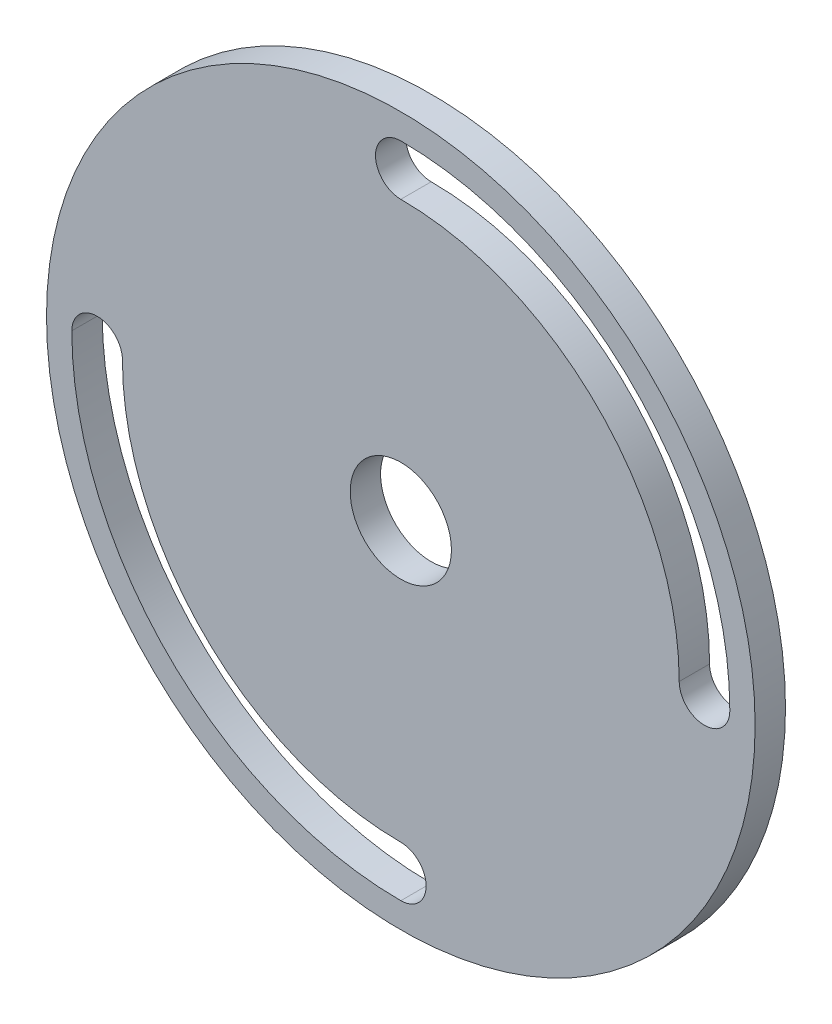
ISO-10303-21;
HEADER;
FILE_DESCRIPTION(('STEP AP214'),'2;1');
FILE_NAME('part.step','',(''),(''),'','','');
FILE_SCHEMA(('AUTOMOTIVE_DESIGN { 1 0 10303 214 1 1 1 1 }'));
ENDSEC;
DATA;
#1=APPLICATION_CONTEXT('core data for automotive mechanical design processes');
#2=APPLICATION_PROTOCOL_DEFINITION('international standard','automotive_design',2000,#1);
#3=PRODUCT_CONTEXT('',#1,'mechanical');
#4=PRODUCT('Part','Part','',(#3));
#5=PRODUCT_RELATED_PRODUCT_CATEGORY('part','',(#4));
#6=PRODUCT_DEFINITION_FORMATION('','',#4);
#7=PRODUCT_DEFINITION_CONTEXT('part definition',#1,'design');
#8=PRODUCT_DEFINITION('design','',#6,#7);
#9=PRODUCT_DEFINITION_SHAPE('','',#8);
#10=(LENGTH_UNIT() NAMED_UNIT(*) SI_UNIT(.MILLI.,.METRE.));
#11=(NAMED_UNIT(*) PLANE_ANGLE_UNIT() SI_UNIT($,.RADIAN.));
#12=(NAMED_UNIT(*) SI_UNIT($,.STERADIAN.) SOLID_ANGLE_UNIT());
#13=UNCERTAINTY_MEASURE_WITH_UNIT(LENGTH_MEASURE(1.E-05),#10,'distance_accuracy_value','');
#14=(GEOMETRIC_REPRESENTATION_CONTEXT(3) GLOBAL_UNCERTAINTY_ASSIGNED_CONTEXT((#13)) GLOBAL_UNIT_ASSIGNED_CONTEXT((#10,
#11,#12)) REPRESENTATION_CONTEXT('',''));
#15=CARTESIAN_POINT('',(0.,0.,0.));
#16=DIRECTION('',(0.,0.,1.));
#17=DIRECTION('',(1.,0.,0.));
#18=AXIS2_PLACEMENT_3D('',#15,#16,#17);
#19=CARTESIAN_POINT('',(0.,-30.0000000000001,3.));
#20=DIRECTION('',(0.,0.,-1.));
#21=DIRECTION('',(-1.,0.,0.));
#22=AXIS2_PLACEMENT_3D('',#19,#20,#21);
#23=CYLINDRICAL_SURFACE('',#22,2.50000000000001);
#24=CARTESIAN_POINT('',(0.,-30.0000000000001,0.));
#25=DIRECTION('',(0.,0.,1.));
#26=DIRECTION('',(1.,0.,0.));
#27=AXIS2_PLACEMENT_3D('',#24,#25,#26);
#28=CIRCLE('',#27,2.50000000000001);
#29=CARTESIAN_POINT('',(0.,-32.5,0.));
#30=VERTEX_POINT('',#29);
#31=CARTESIAN_POINT('',(0.,-27.5,0.));
#32=VERTEX_POINT('',#31);
#33=EDGE_CURVE('E153',#30,#32,#28,.T.);
#34=ORIENTED_EDGE('',*,*,#33,.F.);
#35=DIRECTION('',(0.,0.,-1.));
#36=VECTOR('',#35,1.);
#37=CARTESIAN_POINT('',(0.,-32.5,3.));
#38=LINE('',#37,#36);
#39=CARTESIAN_POINT('',(0.,-32.5,3.));
#40=VERTEX_POINT('',#39);
#41=EDGE_CURVE('E11',#40,#30,#38,.T.);
#42=ORIENTED_EDGE('',*,*,#41,.F.);
#43=CARTESIAN_POINT('',(0.,-30.0000000000001,3.));
#44=DIRECTION('',(0.,0.,1.));
#45=DIRECTION('',(1.,0.,0.));
#46=AXIS2_PLACEMENT_3D('',#43,#44,#45);
#47=CIRCLE('',#46,2.50000000000001);
#48=CARTESIAN_POINT('',(0.,-27.5,3.));
#49=VERTEX_POINT('',#48);
#50=EDGE_CURVE('E124',#40,#49,#47,.T.);
#51=ORIENTED_EDGE('',*,*,#50,.T.);
#52=DIRECTION('',(0.,0.,-1.));
#53=VECTOR('',#52,1.);
#54=CARTESIAN_POINT('',(0.,-27.5,3.));
#55=LINE('',#54,#53);
#56=EDGE_CURVE('E88',#49,#32,#55,.T.);
#57=ORIENTED_EDGE('',*,*,#56,.T.);
#58=EDGE_LOOP('',(#34,#42,#51,#57));
#59=FACE_BOUND('',#58,.T.);
#60=ADVANCED_FACE('F35',(#59),#23,.F.);
#61=CARTESIAN_POINT('',(0.,0.,3.));
#62=DIRECTION('',(0.,0.,-1.));
#63=DIRECTION('',(-1.,0.,0.));
#64=AXIS2_PLACEMENT_3D('',#61,#62,#63);
#65=CYLINDRICAL_SURFACE('',#64,32.5);
#66=CARTESIAN_POINT('',(0.,0.,0.));
#67=DIRECTION('',(0.,0.,1.));
#68=DIRECTION('',(1.,0.,0.));
#69=AXIS2_PLACEMENT_3D('',#66,#67,#68);
#70=CIRCLE('',#69,32.5);
#71=CARTESIAN_POINT('',(-32.5,0.,0.));
#72=VERTEX_POINT('',#71);
#73=EDGE_CURVE('E115',#72,#30,#70,.T.);
#74=ORIENTED_EDGE('',*,*,#73,.F.);
#75=DIRECTION('',(0.,0.,-1.));
#76=VECTOR('',#75,1.);
#77=CARTESIAN_POINT('',(-32.5,0.,3.));
#78=LINE('',#77,#76);
#79=CARTESIAN_POINT('',(-32.5,0.,3.));
#80=VERTEX_POINT('',#79);
#81=EDGE_CURVE('E45',#80,#72,#78,.T.);
#82=ORIENTED_EDGE('',*,*,#81,.F.);
#83=CARTESIAN_POINT('',(0.,0.,3.));
#84=DIRECTION('',(0.,0.,1.));
#85=DIRECTION('',(1.,0.,0.));
#86=AXIS2_PLACEMENT_3D('',#83,#84,#85);
#87=CIRCLE('',#86,32.5);
#88=EDGE_CURVE('E113',#80,#40,#87,.T.);
#89=ORIENTED_EDGE('',*,*,#88,.T.);
#90=ORIENTED_EDGE('',*,*,#41,.T.);
#91=EDGE_LOOP('',(#74,#82,#89,#90));
#92=FACE_BOUND('',#91,.T.);
#93=ADVANCED_FACE('F112',(#92),#65,.F.);
#94=CARTESIAN_POINT('',(-30.,0.,3.));
#95=DIRECTION('',(0.,0.,-1.));
#96=DIRECTION('',(-1.,0.,0.));
#97=AXIS2_PLACEMENT_3D('',#94,#95,#96);
#98=CYLINDRICAL_SURFACE('',#97,2.5);
#99=CARTESIAN_POINT('',(-30.,0.,0.));
#100=DIRECTION('',(0.,0.,1.));
#101=DIRECTION('',(1.,0.,0.));
#102=AXIS2_PLACEMENT_3D('',#99,#100,#101);
#103=CIRCLE('',#102,2.5);
#104=CARTESIAN_POINT('',(-27.5,0.,0.));
#105=VERTEX_POINT('',#104);
#106=EDGE_CURVE('E156',#105,#72,#103,.T.);
#107=ORIENTED_EDGE('',*,*,#106,.F.);
#108=DIRECTION('',(0.,0.,-1.));
#109=VECTOR('',#108,1.);
#110=CARTESIAN_POINT('',(-27.5,0.,3.));
#111=LINE('',#110,#109);
#112=CARTESIAN_POINT('',(-27.5,0.,3.));
#113=VERTEX_POINT('',#112);
#114=EDGE_CURVE('E81',#113,#105,#111,.T.);
#115=ORIENTED_EDGE('',*,*,#114,.F.);
#116=CARTESIAN_POINT('',(-30.,0.,3.));
#117=DIRECTION('',(0.,0.,1.));
#118=DIRECTION('',(1.,0.,0.));
#119=AXIS2_PLACEMENT_3D('',#116,#117,#118);
#120=CIRCLE('',#119,2.5);
#121=EDGE_CURVE('E123',#113,#80,#120,.T.);
#122=ORIENTED_EDGE('',*,*,#121,.T.);
#123=ORIENTED_EDGE('',*,*,#81,.T.);
#124=EDGE_LOOP('',(#107,#115,#122,#123));
#125=FACE_BOUND('',#124,.T.);
#126=ADVANCED_FACE('F127',(#125),#98,.F.);
#127=CARTESIAN_POINT('',(32.5,0.,0.));
#128=VERTEX_POINT('',#127);
#129=CARTESIAN_POINT('',(0.,32.5,0.));
#130=VERTEX_POINT('',#129);
#131=EDGE_CURVE('E138',#128,#130,#70,.T.);
#132=ORIENTED_EDGE('',*,*,#131,.F.);
#133=DIRECTION('',(0.,0.,-1.));
#134=VECTOR('',#133,1.);
#135=CARTESIAN_POINT('',(32.5,0.,3.));
#136=LINE('',#135,#134);
#137=CARTESIAN_POINT('',(32.5,0.,3.));
#138=VERTEX_POINT('',#137);
#139=EDGE_CURVE('E39',#138,#128,#136,.T.);
#140=ORIENTED_EDGE('',*,*,#139,.F.);
#141=CARTESIAN_POINT('',(0.,32.5,3.));
#142=VERTEX_POINT('',#141);
#143=EDGE_CURVE('E126',#138,#142,#87,.T.);
#144=ORIENTED_EDGE('',*,*,#143,.T.);
#145=DIRECTION('',(0.,0.,-1.));
#146=VECTOR('',#145,1.);
#147=CARTESIAN_POINT('',(0.,32.5,3.));
#148=LINE('',#147,#146);
#149=EDGE_CURVE('E137',#142,#130,#148,.T.);
#150=ORIENTED_EDGE('',*,*,#149,.T.);
#151=EDGE_LOOP('',(#132,#140,#144,#150));
#152=FACE_BOUND('',#151,.T.);
#153=ADVANCED_FACE('F179',(#152),#65,.F.);
#154=CARTESIAN_POINT('',(30.,0.,3.));
#155=DIRECTION('',(0.,0.,-1.));
#156=DIRECTION('',(-1.,0.,0.));
#157=AXIS2_PLACEMENT_3D('',#154,#155,#156);
#158=CYLINDRICAL_SURFACE('',#157,2.5);
#159=CARTESIAN_POINT('',(30.,0.,0.));
#160=DIRECTION('',(0.,0.,1.));
#161=DIRECTION('',(1.,0.,0.));
#162=AXIS2_PLACEMENT_3D('',#159,#160,#161);
#163=CIRCLE('',#162,2.5);
#164=CARTESIAN_POINT('',(27.5,0.,0.));
#165=VERTEX_POINT('',#164);
#166=EDGE_CURVE('E141',#128,#165,#163,.F.);
#167=ORIENTED_EDGE('',*,*,#166,.T.);
#168=DIRECTION('',(0.,0.,-1.));
#169=VECTOR('',#168,1.);
#170=CARTESIAN_POINT('',(27.5,0.,3.));
#171=LINE('',#170,#169);
#172=CARTESIAN_POINT('',(27.5,0.,3.));
#173=VERTEX_POINT('',#172);
#174=EDGE_CURVE('E165',#173,#165,#171,.T.);
#175=ORIENTED_EDGE('',*,*,#174,.F.);
#176=CARTESIAN_POINT('',(30.,0.,3.));
#177=DIRECTION('',(0.,0.,1.));
#178=DIRECTION('',(1.,0.,0.));
#179=AXIS2_PLACEMENT_3D('',#176,#177,#178);
#180=CIRCLE('',#179,2.5);
#181=EDGE_CURVE('E173',#138,#173,#180,.F.);
#182=ORIENTED_EDGE('',*,*,#181,.F.);
#183=ORIENTED_EDGE('',*,*,#139,.T.);
#184=EDGE_LOOP('',(#167,#175,#182,#183));
#185=FACE_BOUND('',#184,.T.);
#186=ADVANCED_FACE('F37',(#185),#158,.F.);
#187=CARTESIAN_POINT('',(0.,0.,3.));
#188=DIRECTION('',(0.,0.,-1.));
#189=DIRECTION('',(-1.,0.,0.));
#190=AXIS2_PLACEMENT_3D('',#187,#188,#189);
#191=CYLINDRICAL_SURFACE('',#190,27.5);
#192=CARTESIAN_POINT('',(0.,0.,0.));
#193=DIRECTION('',(0.,0.,1.));
#194=DIRECTION('',(1.,0.,0.));
#195=AXIS2_PLACEMENT_3D('',#192,#193,#194);
#196=CIRCLE('',#195,27.5);
#197=CARTESIAN_POINT('',(0.,27.5,0.));
#198=VERTEX_POINT('',#197);
#199=EDGE_CURVE('E143',#165,#198,#196,.T.);
#200=ORIENTED_EDGE('',*,*,#199,.T.);
#201=DIRECTION('',(0.,0.,-1.));
#202=VECTOR('',#201,1.);
#203=CARTESIAN_POINT('',(0.,27.5,3.));
#204=LINE('',#203,#202);
#205=CARTESIAN_POINT('',(0.,27.5,3.));
#206=VERTEX_POINT('',#205);
#207=EDGE_CURVE('E164',#206,#198,#204,.T.);
#208=ORIENTED_EDGE('',*,*,#207,.F.);
#209=CARTESIAN_POINT('',(0.,0.,3.));
#210=DIRECTION('',(0.,0.,1.));
#211=DIRECTION('',(1.,0.,0.));
#212=AXIS2_PLACEMENT_3D('',#209,#210,#211);
#213=CIRCLE('',#212,27.5);
#214=EDGE_CURVE('E131',#173,#206,#213,.T.);
#215=ORIENTED_EDGE('',*,*,#214,.F.);
#216=ORIENTED_EDGE('',*,*,#174,.T.);
#217=EDGE_LOOP('',(#200,#208,#215,#216));
#218=FACE_BOUND('',#217,.T.);
#219=ADVANCED_FACE('F186',(#218),#191,.T.);
#220=EDGE_CURVE('E147',#105,#32,#196,.T.);
#221=ORIENTED_EDGE('',*,*,#220,.T.);
#222=ORIENTED_EDGE('',*,*,#56,.F.);
#223=EDGE_CURVE('E54',#113,#49,#213,.T.);
#224=ORIENTED_EDGE('',*,*,#223,.F.);
#225=ORIENTED_EDGE('',*,*,#114,.T.);
#226=EDGE_LOOP('',(#221,#222,#224,#225));
#227=FACE_BOUND('',#226,.T.);
#228=ADVANCED_FACE('F188',(#227),#191,.T.);
#229=CARTESIAN_POINT('',(0.,0.,3.));
#230=DIRECTION('',(0.,0.,-1.));
#231=DIRECTION('',(-1.,0.,0.));
#232=AXIS2_PLACEMENT_3D('',#229,#230,#231);
#233=CYLINDRICAL_SURFACE('',#232,5.);
#234=CARTESIAN_POINT('',(0.,0.,3.));
#235=DIRECTION('',(0.,0.,1.));
#236=DIRECTION('',(1.,0.,0.));
#237=AXIS2_PLACEMENT_3D('',#234,#235,#236);
#238=CIRCLE('',#237,5.);
#239=CARTESIAN_POINT('',(5.,0.,3.));
#240=VERTEX_POINT('',#239);
#241=EDGE_CURVE('E310',#240,#240,#238,.T.);
#242=ORIENTED_EDGE('',*,*,#241,.T.);
#243=EDGE_LOOP('',(#242));
#244=FACE_BOUND('',#243,.T.);
#245=CARTESIAN_POINT('',(0.,0.,0.));
#246=DIRECTION('',(0.,0.,1.));
#247=DIRECTION('',(1.,0.,0.));
#248=AXIS2_PLACEMENT_3D('',#245,#246,#247);
#249=CIRCLE('',#248,5.);
#250=CARTESIAN_POINT('',(5.,0.,0.));
#251=VERTEX_POINT('',#250);
#252=EDGE_CURVE('E150',#251,#251,#249,.T.);
#253=ORIENTED_EDGE('',*,*,#252,.F.);
#254=EDGE_LOOP('',(#253));
#255=FACE_BOUND('',#254,.T.);
#256=ADVANCED_FACE('F194',(#244,#255),#233,.F.);
#257=CARTESIAN_POINT('',(0.,30.,3.));
#258=DIRECTION('',(0.,0.,-1.));
#259=DIRECTION('',(-1.,0.,0.));
#260=AXIS2_PLACEMENT_3D('',#257,#258,#259);
#261=CYLINDRICAL_SURFACE('',#260,2.5);
#262=CARTESIAN_POINT('',(0.,30.,0.));
#263=DIRECTION('',(0.,0.,1.));
#264=DIRECTION('',(1.,0.,0.));
#265=AXIS2_PLACEMENT_3D('',#262,#263,#264);
#266=CIRCLE('',#265,2.5);
#267=EDGE_CURVE('E146',#130,#198,#266,.T.);
#268=ORIENTED_EDGE('',*,*,#267,.F.);
#269=ORIENTED_EDGE('',*,*,#149,.F.);
#270=CARTESIAN_POINT('',(0.,30.,3.));
#271=DIRECTION('',(0.,0.,1.));
#272=DIRECTION('',(1.,0.,0.));
#273=AXIS2_PLACEMENT_3D('',#270,#271,#272);
#274=CIRCLE('',#273,2.5);
#275=EDGE_CURVE('E184',#142,#206,#274,.T.);
#276=ORIENTED_EDGE('',*,*,#275,.T.);
#277=ORIENTED_EDGE('',*,*,#207,.T.);
#278=EDGE_LOOP('',(#268,#269,#276,#277));
#279=FACE_BOUND('',#278,.T.);
#280=ADVANCED_FACE('F183',(#279),#261,.F.);
#281=CARTESIAN_POINT('',(0.,0.,3.));
#282=DIRECTION('',(0.,0.,-1.));
#283=DIRECTION('',(-1.,0.,0.));
#284=AXIS2_PLACEMENT_3D('',#281,#282,#283);
#285=CYLINDRICAL_SURFACE('',#284,35.);
#286=CARTESIAN_POINT('',(0.,0.,3.));
#287=DIRECTION('',(0.,0.,1.));
#288=DIRECTION('',(1.,0.,0.));
#289=AXIS2_PLACEMENT_3D('',#286,#287,#288);
#290=CIRCLE('',#289,35.);
#291=CARTESIAN_POINT('',(35.,0.,3.));
#292=VERTEX_POINT('',#291);
#293=EDGE_CURVE('E129',#292,#292,#290,.T.);
#294=ORIENTED_EDGE('',*,*,#293,.F.);
#295=EDGE_LOOP('',(#294));
#296=FACE_BOUND('',#295,.T.);
#297=CARTESIAN_POINT('',(0.,0.,0.));
#298=DIRECTION('',(0.,0.,1.));
#299=DIRECTION('',(1.,0.,0.));
#300=AXIS2_PLACEMENT_3D('',#297,#298,#299);
#301=CIRCLE('',#300,35.);
#302=CARTESIAN_POINT('',(35.,0.,0.));
#303=VERTEX_POINT('',#302);
#304=EDGE_CURVE('E158',#303,#303,#301,.T.);
#305=ORIENTED_EDGE('',*,*,#304,.T.);
#306=EDGE_LOOP('',(#305));
#307=FACE_BOUND('',#306,.T.);
#308=ADVANCED_FACE('F207',(#296,#307),#285,.T.);
#309=CARTESIAN_POINT('',(0.,0.,3.));
#310=DIRECTION('',(0.,0.,1.));
#311=DIRECTION('',(1.,0.,0.));
#312=AXIS2_PLACEMENT_3D('',#309,#310,#311);
#313=PLANE('',#312);
#314=ORIENTED_EDGE('',*,*,#143,.F.);
#315=ORIENTED_EDGE('',*,*,#181,.T.);
#316=ORIENTED_EDGE('',*,*,#214,.T.);
#317=ORIENTED_EDGE('',*,*,#275,.F.);
#318=EDGE_LOOP('',(#314,#315,#316,#317));
#319=FACE_BOUND('',#318,.T.);
#320=ORIENTED_EDGE('',*,*,#241,.F.);
#321=EDGE_LOOP('',(#320));
#322=FACE_BOUND('',#321,.T.);
#323=ORIENTED_EDGE('',*,*,#50,.F.);
#324=ORIENTED_EDGE('',*,*,#88,.F.);
#325=ORIENTED_EDGE('',*,*,#121,.F.);
#326=ORIENTED_EDGE('',*,*,#223,.T.);
#327=EDGE_LOOP('',(#323,#324,#325,#326));
#328=FACE_BOUND('',#327,.T.);
#329=ORIENTED_EDGE('',*,*,#293,.T.);
#330=EDGE_LOOP('',(#329));
#331=FACE_BOUND('',#330,.T.);
#332=ADVANCED_FACE('F121',(#319,#322,#328,#331),#313,.T.);
#333=CARTESIAN_POINT('',(0.,0.,0.));
#334=DIRECTION('',(0.,0.,1.));
#335=DIRECTION('',(1.,0.,0.));
#336=AXIS2_PLACEMENT_3D('',#333,#334,#335);
#337=PLANE('',#336);
#338=ORIENTED_EDGE('',*,*,#131,.T.);
#339=ORIENTED_EDGE('',*,*,#267,.T.);
#340=ORIENTED_EDGE('',*,*,#199,.F.);
#341=ORIENTED_EDGE('',*,*,#166,.F.);
#342=EDGE_LOOP('',(#338,#339,#340,#341));
#343=FACE_BOUND('',#342,.T.);
#344=ORIENTED_EDGE('',*,*,#252,.T.);
#345=EDGE_LOOP('',(#344));
#346=FACE_BOUND('',#345,.T.);
#347=ORIENTED_EDGE('',*,*,#33,.T.);
#348=ORIENTED_EDGE('',*,*,#220,.F.);
#349=ORIENTED_EDGE('',*,*,#106,.T.);
#350=ORIENTED_EDGE('',*,*,#73,.T.);
#351=EDGE_LOOP('',(#347,#348,#349,#350));
#352=FACE_BOUND('',#351,.T.);
#353=ORIENTED_EDGE('',*,*,#304,.F.);
#354=EDGE_LOOP('',(#353));
#355=FACE_BOUND('',#354,.T.);
#356=ADVANCED_FACE('F176',(#343,#346,#352,#355),#337,.F.);
#357=CLOSED_SHELL('',(#60,#93,#126,#153,#186,#219,#228,#256,#280,#308,#332,#356));
#358=MANIFOLD_SOLID_BREP('B2',#357);
#359=ADVANCED_BREP_SHAPE_REPRESENTATION('',(#18,#358),#14);
#360=SHAPE_DEFINITION_REPRESENTATION(#9,#359);
ENDSEC;
END-ISO-10303-21;
